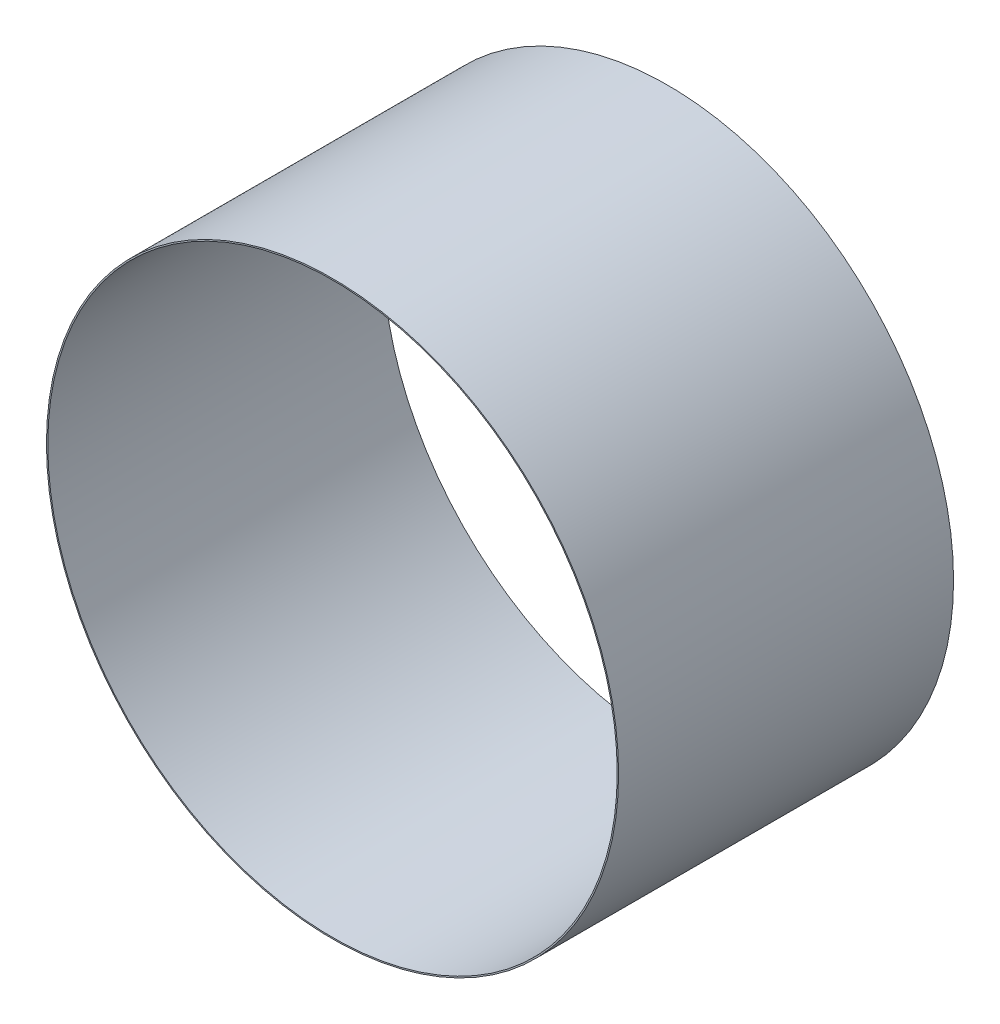
ISO-10303-21;
HEADER;
FILE_DESCRIPTION(('STEP AP214'),'2;1');
FILE_NAME('part.step','',(''),(''),'','','');
FILE_SCHEMA(('AUTOMOTIVE_DESIGN { 1 0 10303 214 1 1 1 1 }'));
ENDSEC;
DATA;
#1=APPLICATION_CONTEXT('core data for automotive mechanical design processes');
#2=APPLICATION_PROTOCOL_DEFINITION('international standard','automotive_design',2000,#1);
#3=PRODUCT_CONTEXT('',#1,'mechanical');
#4=PRODUCT('Part','Part','',(#3));
#5=PRODUCT_RELATED_PRODUCT_CATEGORY('part','',(#4));
#6=PRODUCT_DEFINITION_FORMATION('','',#4);
#7=PRODUCT_DEFINITION_CONTEXT('part definition',#1,'design');
#8=PRODUCT_DEFINITION('design','',#6,#7);
#9=PRODUCT_DEFINITION_SHAPE('','',#8);
#10=(LENGTH_UNIT() NAMED_UNIT(*) SI_UNIT(.MILLI.,.METRE.));
#11=(NAMED_UNIT(*) PLANE_ANGLE_UNIT() SI_UNIT($,.RADIAN.));
#12=(NAMED_UNIT(*) SI_UNIT($,.STERADIAN.) SOLID_ANGLE_UNIT());
#13=UNCERTAINTY_MEASURE_WITH_UNIT(LENGTH_MEASURE(1.E-05),#10,'distance_accuracy_value','');
#14=(GEOMETRIC_REPRESENTATION_CONTEXT(3) GLOBAL_UNCERTAINTY_ASSIGNED_CONTEXT((#13)) GLOBAL_UNIT_ASSIGNED_CONTEXT((#10,
#11,#12)) REPRESENTATION_CONTEXT('',''));
#15=CARTESIAN_POINT('',(0.,0.,0.));
#16=DIRECTION('',(0.,0.,1.));
#17=DIRECTION('',(1.,0.,0.));
#18=AXIS2_PLACEMENT_3D('',#15,#16,#17);
#19=CARTESIAN_POINT('',(0.,0.,0.));
#20=DIRECTION('',(0.,0.,1.));
#21=DIRECTION('',(1.,0.,0.));
#22=AXIS2_PLACEMENT_3D('',#19,#20,#21);
#23=CYLINDRICAL_SURFACE('',#22,42.7);
#24=CARTESIAN_POINT('',(0.,0.,50.));
#25=DIRECTION('',(0.,0.,1.));
#26=DIRECTION('',(1.,0.,0.));
#27=AXIS2_PLACEMENT_3D('',#24,#25,#26);
#28=CIRCLE('',#27,42.7);
#29=CARTESIAN_POINT('',(-42.7,0.,50.));
#30=VERTEX_POINT('',#29);
#31=EDGE_CURVE('E28',#30,#30,#28,.T.);
#32=ORIENTED_EDGE('',*,*,#31,.F.);
#33=DIRECTION('',(0.,0.,-1.));
#34=VECTOR('',#33,1.);
#35=CARTESIAN_POINT('',(-42.7,0.,0.));
#36=LINE('',#35,#34);
#37=CARTESIAN_POINT('',(-42.7,0.,0.));
#38=VERTEX_POINT('',#37);
#39=EDGE_CURVE('E11',#30,#38,#36,.T.);
#40=ORIENTED_EDGE('',*,*,#39,.T.);
#41=CARTESIAN_POINT('',(0.,0.,0.));
#42=DIRECTION('',(0.,0.,1.));
#43=DIRECTION('',(1.,0.,0.));
#44=AXIS2_PLACEMENT_3D('',#41,#42,#43);
#45=CIRCLE('',#44,42.7);
#46=EDGE_CURVE('E56',#38,#38,#45,.T.);
#47=ORIENTED_EDGE('',*,*,#46,.T.);
#48=ORIENTED_EDGE('',*,*,#39,.F.);
#49=EDGE_LOOP('',(#32,#40,#47,#48));
#50=FACE_BOUND('',#49,.T.);
#51=ADVANCED_FACE('F17',(#50),#23,.T.);
#52=CARTESIAN_POINT('',(0.,0.,50.));
#53=DIRECTION('',(0.,0.,1.));
#54=DIRECTION('',(1.,0.,0.));
#55=AXIS2_PLACEMENT_3D('',#52,#53,#54);
#56=PLANE('',#55);
#57=CARTESIAN_POINT('',(0.,0.,50.));
#58=DIRECTION('',(0.,0.,-1.));
#59=DIRECTION('',(1.,0.,0.));
#60=AXIS2_PLACEMENT_3D('',#57,#58,#59);
#61=CIRCLE('',#60,42.5);
#62=CARTESIAN_POINT('',(-42.5,0.,50.));
#63=VERTEX_POINT('',#62);
#64=EDGE_CURVE('E59',#63,#63,#61,.T.);
#65=ORIENTED_EDGE('',*,*,#64,.T.);
#66=EDGE_LOOP('',(#65));
#67=FACE_BOUND('',#66,.T.);
#68=ORIENTED_EDGE('',*,*,#31,.T.);
#69=EDGE_LOOP('',(#68));
#70=FACE_BOUND('',#69,.T.);
#71=ADVANCED_FACE('F77',(#67,#70),#56,.T.);
#72=CARTESIAN_POINT('',(0.,0.,0.));
#73=DIRECTION('',(0.,0.,1.));
#74=DIRECTION('',(1.,0.,0.));
#75=AXIS2_PLACEMENT_3D('',#72,#73,#74);
#76=CYLINDRICAL_SURFACE('',#75,42.5);
#77=CARTESIAN_POINT('',(0.,0.,0.));
#78=DIRECTION('',(0.,0.,-1.));
#79=DIRECTION('',(1.,0.,0.));
#80=AXIS2_PLACEMENT_3D('',#77,#78,#79);
#81=CIRCLE('',#80,42.5);
#82=CARTESIAN_POINT('',(-42.5,0.,0.));
#83=VERTEX_POINT('',#82);
#84=EDGE_CURVE('E67',#83,#83,#81,.T.);
#85=ORIENTED_EDGE('',*,*,#84,.T.);
#86=DIRECTION('',(0.,0.,1.));
#87=VECTOR('',#86,1.);
#88=CARTESIAN_POINT('',(-42.5,0.,0.));
#89=LINE('',#88,#87);
#90=EDGE_CURVE('E21',#83,#63,#89,.T.);
#91=ORIENTED_EDGE('',*,*,#90,.T.);
#92=ORIENTED_EDGE('',*,*,#64,.F.);
#93=ORIENTED_EDGE('',*,*,#90,.F.);
#94=EDGE_LOOP('',(#85,#91,#92,#93));
#95=FACE_BOUND('',#94,.T.);
#96=ADVANCED_FACE('F19',(#95),#76,.F.);
#97=CARTESIAN_POINT('',(0.,0.,0.));
#98=DIRECTION('',(0.,0.,1.));
#99=DIRECTION('',(1.,0.,0.));
#100=AXIS2_PLACEMENT_3D('',#97,#98,#99);
#101=PLANE('',#100);
#102=ORIENTED_EDGE('',*,*,#84,.F.);
#103=EDGE_LOOP('',(#102));
#104=FACE_BOUND('',#103,.T.);
#105=ORIENTED_EDGE('',*,*,#46,.F.);
#106=EDGE_LOOP('',(#105));
#107=FACE_BOUND('',#106,.T.);
#108=ADVANCED_FACE('F84',(#104,#107),#101,.F.);
#109=CLOSED_SHELL('',(#51,#71,#96,#108));
#110=MANIFOLD_SOLID_BREP('B1',#109);
#111=ADVANCED_BREP_SHAPE_REPRESENTATION('',(#18,#110),#14);
#112=SHAPE_DEFINITION_REPRESENTATION(#9,#111);
ENDSEC;
END-ISO-10303-21;
